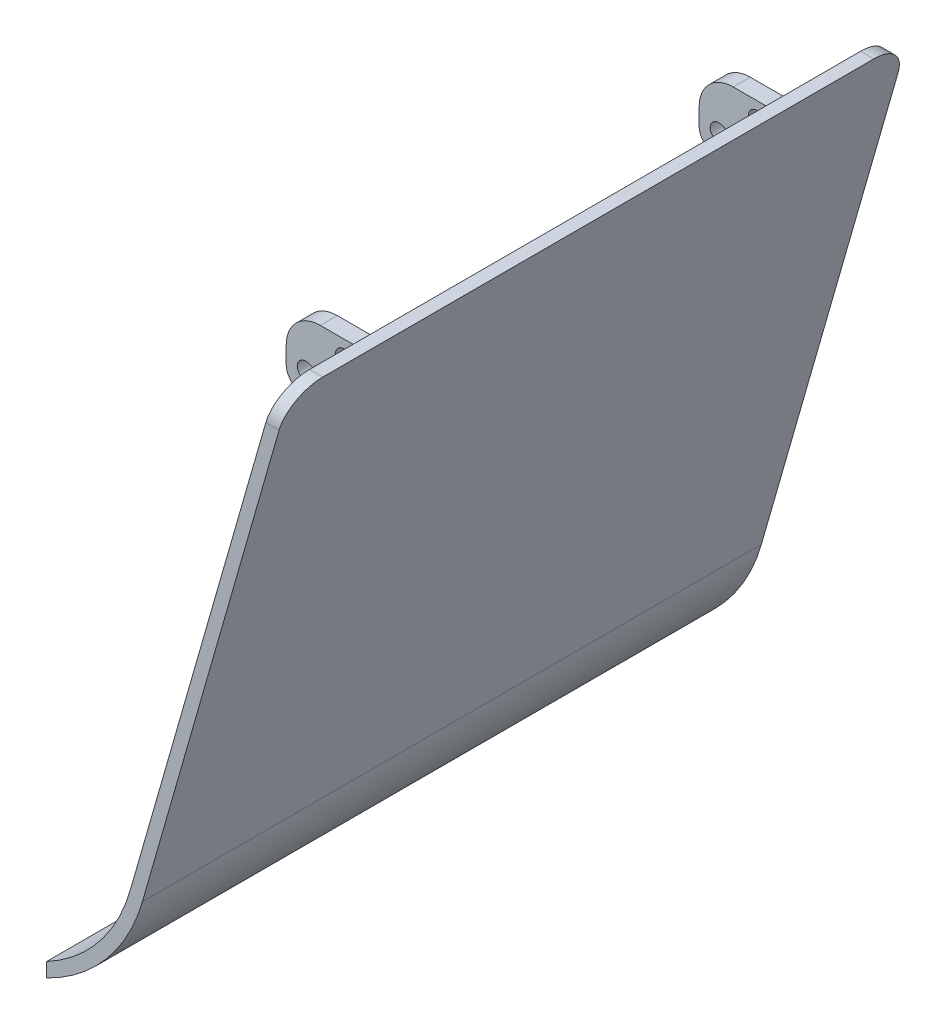
ISO-10303-21;
HEADER;
FILE_DESCRIPTION(('STEP AP214'),'2;1');
FILE_NAME('part.step','',(''),(''),'','','');
FILE_SCHEMA(('AUTOMOTIVE_DESIGN { 1 0 10303 214 1 1 1 1 }'));
ENDSEC;
DATA;
#1=APPLICATION_CONTEXT('core data for automotive mechanical design processes');
#2=APPLICATION_PROTOCOL_DEFINITION('international standard','automotive_design',2000,#1);
#3=PRODUCT_CONTEXT('',#1,'mechanical');
#4=PRODUCT('Part','Part','',(#3));
#5=PRODUCT_RELATED_PRODUCT_CATEGORY('part','',(#4));
#6=PRODUCT_DEFINITION_FORMATION('','',#4);
#7=PRODUCT_DEFINITION_CONTEXT('part definition',#1,'design');
#8=PRODUCT_DEFINITION('design','',#6,#7);
#9=PRODUCT_DEFINITION_SHAPE('','',#8);
#10=(LENGTH_UNIT() NAMED_UNIT(*) SI_UNIT(.MILLI.,.METRE.));
#11=(NAMED_UNIT(*) PLANE_ANGLE_UNIT() SI_UNIT($,.RADIAN.));
#12=(NAMED_UNIT(*) SI_UNIT($,.STERADIAN.) SOLID_ANGLE_UNIT());
#13=UNCERTAINTY_MEASURE_WITH_UNIT(LENGTH_MEASURE(1.E-05),#10,'distance_accuracy_value','');
#14=(GEOMETRIC_REPRESENTATION_CONTEXT(3) GLOBAL_UNCERTAINTY_ASSIGNED_CONTEXT((#13)) GLOBAL_UNIT_ASSIGNED_CONTEXT((#10,
#11,#12)) REPRESENTATION_CONTEXT('',''));
#15=CARTESIAN_POINT('',(0.,0.,0.));
#16=DIRECTION('',(0.,0.,1.));
#17=DIRECTION('',(1.,0.,0.));
#18=AXIS2_PLACEMENT_3D('',#15,#16,#17);
#19=CARTESIAN_POINT('',(-0.573490771517624,-2.,-23.3));
#20=DIRECTION('',(0.,0.,-1.));
#21=DIRECTION('',(1.,0.,0.));
#22=AXIS2_PLACEMENT_3D('',#19,#20,#21);
#23=PLANE('',#22);
#24=DIRECTION('',(0.,-1.,0.));
#25=VECTOR('',#24,1.);
#26=CARTESIAN_POINT('',(-9.86745385758813,-2.,-23.3));
#27=LINE('',#26,#25);
#28=CARTESIAN_POINT('',(-9.86745385758812,-6.,-23.3));
#29=VERTEX_POINT('',#28);
#30=CARTESIAN_POINT('',(-9.86745385758812,-8.,-23.3));
#31=VERTEX_POINT('',#30);
#32=EDGE_CURVE('E264',#29,#31,#27,.T.);
#33=ORIENTED_EDGE('',*,*,#32,.T.);
#34=CARTESIAN_POINT('',(-7.86745385758812,-8.,-23.3));
#35=DIRECTION('',(0.,0.,-1.));
#36=DIRECTION('',(-1.,0.,0.));
#37=AXIS2_PLACEMENT_3D('',#34,#35,#36);
#38=CIRCLE('',#37,2.);
#39=CARTESIAN_POINT('',(-7.86745385758812,-10.,-23.3));
#40=VERTEX_POINT('',#39);
#41=EDGE_CURVE('E11',#31,#40,#38,.F.);
#42=ORIENTED_EDGE('',*,*,#41,.T.);
#43=DIRECTION('',(1.,0.,0.));
#44=VECTOR('',#43,1.);
#45=CARTESIAN_POINT('',(-9.86745385758812,-10.,-23.3));
#46=LINE('',#45,#44);
#47=CARTESIAN_POINT('',(-2.86745385758812,-10.,-23.3));
#48=VERTEX_POINT('',#47);
#49=EDGE_CURVE('E261',#40,#48,#46,.T.);
#50=ORIENTED_EDGE('',*,*,#49,.T.);
#51=DIRECTION('',(0.275637355817003,0.961261695938318,0.));
#52=VECTOR('',#51,1.);
#53=CARTESIAN_POINT('',(-2.86745385758812,-10.,-23.3));
#54=LINE('',#53,#52);
#55=CARTESIAN_POINT('',(-0.573490771517624,-2.,-23.3));
#56=VERTEX_POINT('',#55);
#57=EDGE_CURVE('E258',#48,#56,#54,.T.);
#58=ORIENTED_EDGE('',*,*,#57,.T.);
#59=DIRECTION('',(-1.,0.,0.));
#60=VECTOR('',#59,1.);
#61=CARTESIAN_POINT('',(-0.573490771517624,-2.,-23.3));
#62=LINE('',#61,#60);
#63=CARTESIAN_POINT('',(-5.86745385758812,-2.,-23.3));
#64=VERTEX_POINT('',#63);
#65=EDGE_CURVE('E266',#56,#64,#62,.T.);
#66=ORIENTED_EDGE('',*,*,#65,.T.);
#67=CARTESIAN_POINT('',(-5.86745385758812,-6.,-23.3));
#68=DIRECTION('',(0.,0.,-1.));
#69=DIRECTION('',(-1.,0.,0.));
#70=AXIS2_PLACEMENT_3D('',#67,#68,#69);
#71=CIRCLE('',#70,4.);
#72=EDGE_CURVE('E427',#64,#29,#71,.F.);
#73=ORIENTED_EDGE('',*,*,#72,.T.);
#74=EDGE_LOOP('',(#33,#42,#50,#58,#66,#73));
#75=FACE_BOUND('',#74,.T.);
#76=CARTESIAN_POINT('',(-6.21585626373581,-4.60204194662536,-23.3));
#77=DIRECTION('',(0.,0.,-1.));
#78=DIRECTION('',(-1.,0.,0.));
#79=AXIS2_PLACEMENT_3D('',#76,#77,#78);
#80=CIRCLE('',#79,2.2);
#81=CARTESIAN_POINT('',(-4.05514258241743,-4.18813810832042,-23.3));
#82=VERTEX_POINT('',#81);
#83=CARTESIAN_POINT('',(-7.14889258241743,-6.59438810832043,-23.3));
#84=VERTEX_POINT('',#83);
#85=EDGE_CURVE('E255',#82,#84,#80,.T.);
#86=ORIENTED_EDGE('',*,*,#85,.F.);
#87=CARTESIAN_POINT('',(-3.07299999999998,-4.,-23.3));
#88=DIRECTION('',(0.,0.,-1.));
#89=DIRECTION('',(-1.,0.,0.));
#90=AXIS2_PLACEMENT_3D('',#87,#88,#89);
#91=CIRCLE('',#90,1.);
#92=CARTESIAN_POINT('',(-2.09085741758253,-3.81186189167957,-23.3));
#93=VERTEX_POINT('',#92);
#94=EDGE_CURVE('E248',#93,#82,#91,.F.);
#95=ORIENTED_EDGE('',*,*,#94,.F.);
#96=CARTESIAN_POINT('',(-6.21585626373581,-4.60204194662536,-23.3));
#97=DIRECTION('',(0.,0.,-1.));
#98=DIRECTION('',(-1.,0.,0.));
#99=AXIS2_PLACEMENT_3D('',#96,#97,#98);
#100=CIRCLE('',#99,4.2);
#101=CARTESIAN_POINT('',(-7.99710741758254,-8.40561189167958,-23.3));
#102=VERTEX_POINT('',#101);
#103=EDGE_CURVE('E224',#102,#93,#100,.F.);
#104=ORIENTED_EDGE('',*,*,#103,.F.);
#105=CARTESIAN_POINT('',(-7.57299999999998,-7.5,-23.3));
#106=DIRECTION('',(0.,0.,-1.));
#107=DIRECTION('',(-1.,0.,0.));
#108=AXIS2_PLACEMENT_3D('',#105,#106,#107);
#109=CIRCLE('',#108,1.);
#110=EDGE_CURVE('E253',#84,#102,#109,.F.);
#111=ORIENTED_EDGE('',*,*,#110,.F.);
#112=EDGE_LOOP('',(#86,#95,#104,#111));
#113=FACE_BOUND('',#112,.T.);
#114=ADVANCED_FACE('F31',(#75,#113),#23,.F.);
#115=CARTESIAN_POINT('',(-0.573490771517624,-2.,-25.3));
#116=DIRECTION('',(0.,0.,-1.));
#117=DIRECTION('',(1.,0.,0.));
#118=AXIS2_PLACEMENT_3D('',#115,#116,#117);
#119=PLANE('',#118);
#120=DIRECTION('',(1.,0.,0.));
#121=VECTOR('',#120,1.);
#122=CARTESIAN_POINT('',(-9.86745385758812,-10.,-25.3));
#123=LINE('',#122,#121);
#124=CARTESIAN_POINT('',(-7.86745385758812,-10.,-25.3));
#125=VERTEX_POINT('',#124);
#126=CARTESIAN_POINT('',(-2.86745385758812,-10.,-25.3));
#127=VERTEX_POINT('',#126);
#128=EDGE_CURVE('E272',#125,#127,#123,.T.);
#129=ORIENTED_EDGE('',*,*,#128,.F.);
#130=CARTESIAN_POINT('',(-7.86745385758812,-8.,-25.3));
#131=DIRECTION('',(0.,0.,-1.));
#132=DIRECTION('',(-1.,0.,0.));
#133=AXIS2_PLACEMENT_3D('',#130,#131,#132);
#134=CIRCLE('',#133,2.);
#135=CARTESIAN_POINT('',(-9.86745385758812,-8.,-25.3));
#136=VERTEX_POINT('',#135);
#137=EDGE_CURVE('E53',#125,#136,#134,.T.);
#138=ORIENTED_EDGE('',*,*,#137,.T.);
#139=DIRECTION('',(0.,-1.,0.));
#140=VECTOR('',#139,1.);
#141=CARTESIAN_POINT('',(-9.86745385758813,-2.,-25.3));
#142=LINE('',#141,#140);
#143=CARTESIAN_POINT('',(-9.86745385758812,-6.,-25.3));
#144=VERTEX_POINT('',#143);
#145=EDGE_CURVE('E274',#144,#136,#142,.T.);
#146=ORIENTED_EDGE('',*,*,#145,.F.);
#147=CARTESIAN_POINT('',(-5.86745385758812,-6.,-25.3));
#148=DIRECTION('',(0.,0.,-1.));
#149=DIRECTION('',(-1.,0.,0.));
#150=AXIS2_PLACEMENT_3D('',#147,#148,#149);
#151=CIRCLE('',#150,4.);
#152=CARTESIAN_POINT('',(-5.86745385758812,-2.,-25.3));
#153=VERTEX_POINT('',#152);
#154=EDGE_CURVE('E423',#144,#153,#151,.T.);
#155=ORIENTED_EDGE('',*,*,#154,.T.);
#156=DIRECTION('',(-1.,0.,0.));
#157=VECTOR('',#156,1.);
#158=CARTESIAN_POINT('',(-0.573490771517624,-2.,-25.3));
#159=LINE('',#158,#157);
#160=CARTESIAN_POINT('',(-0.573490771517624,-2.,-25.3));
#161=VERTEX_POINT('',#160);
#162=EDGE_CURVE('E262',#161,#153,#159,.T.);
#163=ORIENTED_EDGE('',*,*,#162,.F.);
#164=DIRECTION('',(0.275637355817003,0.961261695938318,0.));
#165=VECTOR('',#164,1.);
#166=CARTESIAN_POINT('',(-2.86745385758812,-10.,-25.3));
#167=LINE('',#166,#165);
#168=EDGE_CURVE('E257',#127,#161,#167,.T.);
#169=ORIENTED_EDGE('',*,*,#168,.F.);
#170=EDGE_LOOP('',(#129,#138,#146,#155,#163,#169));
#171=FACE_BOUND('',#170,.T.);
#172=CARTESIAN_POINT('',(-3.07299999999998,-4.,-25.3));
#173=DIRECTION('',(0.,0.,1.));
#174=DIRECTION('',(1.,0.,0.));
#175=AXIS2_PLACEMENT_3D('',#172,#173,#174);
#176=CIRCLE('',#175,1.);
#177=CARTESIAN_POINT('',(-2.09085741758253,-3.81186189167957,-25.3));
#178=VERTEX_POINT('',#177);
#179=CARTESIAN_POINT('',(-4.05514258241743,-4.18813810832042,-25.3));
#180=VERTEX_POINT('',#179);
#181=EDGE_CURVE('E232',#178,#180,#176,.T.);
#182=ORIENTED_EDGE('',*,*,#181,.T.);
#183=CARTESIAN_POINT('',(-6.21585626373581,-4.60204194662536,-25.3));
#184=DIRECTION('',(0.,0.,-1.));
#185=DIRECTION('',(1.,0.,0.));
#186=AXIS2_PLACEMENT_3D('',#183,#184,#185);
#187=CIRCLE('',#186,2.2);
#188=CARTESIAN_POINT('',(-7.14889258241743,-6.59438810832043,-25.3));
#189=VERTEX_POINT('',#188);
#190=EDGE_CURVE('E237',#180,#189,#187,.T.);
#191=ORIENTED_EDGE('',*,*,#190,.T.);
#192=CARTESIAN_POINT('',(-7.57299999999998,-7.5,-25.3));
#193=DIRECTION('',(0.,0.,1.));
#194=DIRECTION('',(1.,0.,0.));
#195=AXIS2_PLACEMENT_3D('',#192,#193,#194);
#196=CIRCLE('',#195,1.);
#197=CARTESIAN_POINT('',(-7.99710741758254,-8.40561189167958,-25.3));
#198=VERTEX_POINT('',#197);
#199=EDGE_CURVE('E241',#189,#198,#196,.T.);
#200=ORIENTED_EDGE('',*,*,#199,.T.);
#201=CARTESIAN_POINT('',(-6.21585626373581,-4.60204194662536,-25.3));
#202=DIRECTION('',(0.,0.,1.));
#203=DIRECTION('',(1.,0.,0.));
#204=AXIS2_PLACEMENT_3D('',#201,#202,#203);
#205=CIRCLE('',#204,4.2);
#206=EDGE_CURVE('E221',#198,#178,#205,.T.);
#207=ORIENTED_EDGE('',*,*,#206,.T.);
#208=EDGE_LOOP('',(#182,#191,#200,#207));
#209=FACE_BOUND('',#208,.T.);
#210=ADVANCED_FACE('F239',(#171,#209),#119,.T.);
#211=CARTESIAN_POINT('',(0.,0.,36.425));
#212=DIRECTION('',(0.961261695938318,-0.275637355817003,0.));
#213=DIRECTION('',(0.275637355817003,0.961261695938318,0.));
#214=AXIS2_PLACEMENT_3D('',#211,#212,#213);
#215=PLANE('',#214);
#216=DIRECTION('',(0.275637355817003,0.961261695938318,0.));
#217=VECTOR('',#216,1.);
#218=CARTESIAN_POINT('',(-2.86745385758812,-10.,23.3));
#219=LINE('',#218,#217);
#220=CARTESIAN_POINT('',(-2.86745385758812,-10.,23.3));
#221=VERTEX_POINT('',#220);
#222=CARTESIAN_POINT('',(-0.573490771517624,-2.,23.3));
#223=VERTEX_POINT('',#222);
#224=EDGE_CURVE('E315',#221,#223,#219,.T.);
#225=ORIENTED_EDGE('',*,*,#224,.T.);
#226=DIRECTION('',(0.,0.,1.));
#227=VECTOR('',#226,1.);
#228=CARTESIAN_POINT('',(-0.573490771517624,-2.,23.3));
#229=LINE('',#228,#227);
#230=CARTESIAN_POINT('',(-0.573490771517624,-2.,25.3));
#231=VERTEX_POINT('',#230);
#232=EDGE_CURVE('E327',#223,#231,#229,.T.);
#233=ORIENTED_EDGE('',*,*,#232,.T.);
#234=DIRECTION('',(0.275637355817003,0.961261695938318,0.));
#235=VECTOR('',#234,1.);
#236=CARTESIAN_POINT('',(-2.86745385758812,-10.,25.3));
#237=LINE('',#236,#235);
#238=CARTESIAN_POINT('',(-2.86745385758812,-10.,25.3));
#239=VERTEX_POINT('',#238);
#240=EDGE_CURVE('E314',#239,#231,#237,.T.);
#241=ORIENTED_EDGE('',*,*,#240,.F.);
#242=DIRECTION('',(0.,0.,1.));
#243=VECTOR('',#242,1.);
#244=CARTESIAN_POINT('',(-2.86745385758812,-10.,23.3));
#245=LINE('',#244,#243);
#246=EDGE_CURVE('E337',#221,#239,#245,.T.);
#247=ORIENTED_EDGE('',*,*,#246,.F.);
#248=EDGE_LOOP('',(#225,#233,#241,#247));
#249=FACE_BOUND('',#248,.T.);
#250=DIRECTION('',(0.,0.,-1.));
#251=VECTOR('',#250,1.);
#252=CARTESIAN_POINT('',(0.,0.,36.425));
#253=LINE('',#252,#251);
#254=CARTESIAN_POINT('',(0.,0.,32.425));
#255=VERTEX_POINT('',#254);
#256=CARTESIAN_POINT('',(0.,0.,-32.425));
#257=VERTEX_POINT('',#256);
#258=EDGE_CURVE('E381',#255,#257,#253,.T.);
#259=ORIENTED_EDGE('',*,*,#258,.T.);
#260=CARTESIAN_POINT('',(-1.14698154303525,-4.,-32.425));
#261=DIRECTION('',(0.961261695938318,-0.275637355817003,0.));
#262=DIRECTION('',(-0.275637355817003,-0.961261695938318,0.));
#263=AXIS2_PLACEMENT_3D('',#260,#261,#262);
#264=ELLIPSE('',#263,4.16119774344641,4.);
#265=CARTESIAN_POINT('',(-1.14698154303525,-4.,-36.425));
#266=VERTEX_POINT('',#265);
#267=EDGE_CURVE('E391',#257,#266,#264,.F.);
#268=ORIENTED_EDGE('',*,*,#267,.T.);
#269=DIRECTION('',(-0.275637355817003,-0.961261695938318,0.));
#270=VECTOR('',#269,1.);
#271=CARTESIAN_POINT('',(0.,0.,-36.425));
#272=LINE('',#271,#270);
#273=CARTESIAN_POINT('',(-17.110884891163,-59.67274711634,-36.425));
#274=VERTEX_POINT('',#273);
#275=EDGE_CURVE('E352',#266,#274,#272,.T.);
#276=ORIENTED_EDGE('',*,*,#275,.T.);
#277=DIRECTION('',(0.,0.,-1.));
#278=VECTOR('',#277,1.);
#279=CARTESIAN_POINT('',(-17.110884891163,-59.67274711634,36.425));
#280=LINE('',#279,#278);
#281=CARTESIAN_POINT('',(-17.110884891163,-59.67274711634,36.425));
#282=VERTEX_POINT('',#281);
#283=EDGE_CURVE('E378',#282,#274,#280,.T.);
#284=ORIENTED_EDGE('',*,*,#283,.F.);
#285=DIRECTION('',(-0.275637355817003,-0.961261695938318,0.));
#286=VECTOR('',#285,1.);
#287=CARTESIAN_POINT('',(0.,0.,36.425));
#288=LINE('',#287,#286);
#289=CARTESIAN_POINT('',(-1.14698154303525,-4.,36.425));
#290=VERTEX_POINT('',#289);
#291=EDGE_CURVE('E353',#290,#282,#288,.T.);
#292=ORIENTED_EDGE('',*,*,#291,.F.);
#293=CARTESIAN_POINT('',(-1.14698154303525,-4.,32.425));
#294=DIRECTION('',(0.961261695938318,-0.275637355817003,0.));
#295=DIRECTION('',(0.275637355817003,0.961261695938318,0.));
#296=AXIS2_PLACEMENT_3D('',#293,#294,#295);
#297=ELLIPSE('',#296,4.16119774344641,4.);
#298=EDGE_CURVE('E389',#290,#255,#297,.F.);
#299=ORIENTED_EDGE('',*,*,#298,.T.);
#300=EDGE_LOOP('',(#259,#268,#276,#284,#292,#299));
#301=FACE_BOUND('',#300,.T.);
#302=ORIENTED_EDGE('',*,*,#57,.F.);
#303=DIRECTION('',(0.,0.,-1.));
#304=VECTOR('',#303,1.);
#305=CARTESIAN_POINT('',(-2.86745385758812,-10.,-23.3));
#306=LINE('',#305,#304);
#307=EDGE_CURVE('E269',#48,#127,#306,.T.);
#308=ORIENTED_EDGE('',*,*,#307,.T.);
#309=ORIENTED_EDGE('',*,*,#168,.T.);
#310=DIRECTION('',(0.,0.,-1.));
#311=VECTOR('',#310,1.);
#312=CARTESIAN_POINT('',(-0.573490771517624,-2.,-23.3));
#313=LINE('',#312,#311);
#314=EDGE_CURVE('E278',#56,#161,#313,.T.);
#315=ORIENTED_EDGE('',*,*,#314,.F.);
#316=EDGE_LOOP('',(#302,#308,#309,#315));
#317=FACE_BOUND('',#316,.T.);
#318=ADVANCED_FACE('F444',(#249,#301,#317),#215,.F.);
#319=CARTESIAN_POINT('',(0.,0.,36.425));
#320=DIRECTION('',(0.,-1.,0.));
#321=DIRECTION('',(0.,0.,-1.));
#322=AXIS2_PLACEMENT_3D('',#319,#320,#321);
#323=PLANE('',#322);
#324=DIRECTION('',(0.,0.,-1.));
#325=VECTOR('',#324,1.);
#326=CARTESIAN_POINT('',(1.5604491537924,0.,36.425));
#327=LINE('',#326,#325);
#328=CARTESIAN_POINT('',(1.5604491537924,0.,32.425));
#329=VERTEX_POINT('',#328);
#330=CARTESIAN_POINT('',(1.5604491537924,0.,-32.425));
#331=VERTEX_POINT('',#330);
#332=EDGE_CURVE('E364',#329,#331,#327,.T.);
#333=ORIENTED_EDGE('',*,*,#332,.T.);
#334=DIRECTION('',(-1.,0.,0.));
#335=VECTOR('',#334,1.);
#336=CARTESIAN_POINT('',(0.,0.,-32.425));
#337=LINE('',#336,#335);
#338=EDGE_CURVE('E386',#331,#257,#337,.T.);
#339=ORIENTED_EDGE('',*,*,#338,.T.);
#340=ORIENTED_EDGE('',*,*,#258,.F.);
#341=DIRECTION('',(-1.,0.,0.));
#342=VECTOR('',#341,1.);
#343=CARTESIAN_POINT('',(1.56044915379241,0.,32.425));
#344=LINE('',#343,#342);
#345=EDGE_CURVE('E384',#255,#329,#344,.F.);
#346=ORIENTED_EDGE('',*,*,#345,.T.);
#347=EDGE_LOOP('',(#333,#339,#340,#346));
#348=FACE_BOUND('',#347,.T.);
#349=ADVANCED_FACE('F536',(#348),#323,.F.);
#350=CARTESIAN_POINT('',(-36.3361188099293,-54.16,36.425));
#351=DIRECTION('',(0.,0.,-1.));
#352=DIRECTION('',(-1.,0.,0.));
#353=AXIS2_PLACEMENT_3D('',#350,#351,#352);
#354=CYLINDRICAL_SURFACE('',#353,20.);
#355=CARTESIAN_POINT('',(-36.3361188099293,-54.16,-36.425));
#356=DIRECTION('',(0.,0.,-1.));
#357=DIRECTION('',(1.,0.,0.));
#358=AXIS2_PLACEMENT_3D('',#355,#356,#357);
#359=CIRCLE('',#358,20.);
#360=CARTESIAN_POINT('',(-26.9438666838416,-71.8174516847704,-36.425));
#361=VERTEX_POINT('',#360);
#362=EDGE_CURVE('E366',#274,#361,#359,.T.);
#363=ORIENTED_EDGE('',*,*,#362,.T.);
#364=DIRECTION('',(0.,0.,1.));
#365=VECTOR('',#364,1.);
#366=CARTESIAN_POINT('',(-26.9438666838416,-71.8174516847704,-36.425));
#367=LINE('',#366,#365);
#368=CARTESIAN_POINT('',(-26.9438666838416,-71.8174516847704,36.425));
#369=VERTEX_POINT('',#368);
#370=EDGE_CURVE('E346',#361,#369,#367,.T.);
#371=ORIENTED_EDGE('',*,*,#370,.T.);
#372=CARTESIAN_POINT('',(-36.3361188099293,-54.16,36.425));
#373=DIRECTION('',(0.,0.,-1.));
#374=DIRECTION('',(1.,0.,0.));
#375=AXIS2_PLACEMENT_3D('',#372,#373,#374);
#376=CIRCLE('',#375,20.);
#377=EDGE_CURVE('E355',#282,#369,#376,.T.);
#378=ORIENTED_EDGE('',*,*,#377,.F.);
#379=ORIENTED_EDGE('',*,*,#283,.T.);
#380=EDGE_LOOP('',(#363,#371,#378,#379));
#381=FACE_BOUND('',#380,.T.);
#382=ADVANCED_FACE('F532',(#381),#354,.F.);
#383=CARTESIAN_POINT('',(-36.3361188099293,-54.16,36.425));
#384=DIRECTION('',(0.,0.,-1.));
#385=DIRECTION('',(-1.,0.,0.));
#386=AXIS2_PLACEMENT_3D('',#383,#384,#385);
#387=CYLINDRICAL_SURFACE('',#386,21.5);
#388=CARTESIAN_POINT('',(-36.3361188099293,-54.16,36.425));
#389=DIRECTION('',(0.,0.,1.));
#390=DIRECTION('',(1.,0.,0.));
#391=AXIS2_PLACEMENT_3D('',#388,#389,#390);
#392=CIRCLE('',#391,21.5);
#393=CARTESIAN_POINT('',(-26.9438666838416,-73.5,36.425));
#394=VERTEX_POINT('',#393);
#395=CARTESIAN_POINT('',(-15.6689923472555,-60.0862031500656,36.425));
#396=VERTEX_POINT('',#395);
#397=EDGE_CURVE('E359',#394,#396,#392,.T.);
#398=ORIENTED_EDGE('',*,*,#397,.F.);
#399=DIRECTION('',(0.,0.,1.));
#400=VECTOR('',#399,1.);
#401=CARTESIAN_POINT('',(-26.9438666838416,-73.5,-36.425));
#402=LINE('',#401,#400);
#403=CARTESIAN_POINT('',(-26.9438666838416,-73.5,-36.425));
#404=VERTEX_POINT('',#403);
#405=EDGE_CURVE('E350',#404,#394,#402,.T.);
#406=ORIENTED_EDGE('',*,*,#405,.F.);
#407=CARTESIAN_POINT('',(-36.3361188099293,-54.16,-36.425));
#408=DIRECTION('',(0.,0.,1.));
#409=DIRECTION('',(1.,0.,0.));
#410=AXIS2_PLACEMENT_3D('',#407,#408,#409);
#411=CIRCLE('',#410,21.5);
#412=CARTESIAN_POINT('',(-15.6689923472555,-60.0862031500656,-36.425));
#413=VERTEX_POINT('',#412);
#414=EDGE_CURVE('E369',#404,#413,#411,.T.);
#415=ORIENTED_EDGE('',*,*,#414,.T.);
#416=DIRECTION('',(0.,0.,-1.));
#417=VECTOR('',#416,1.);
#418=CARTESIAN_POINT('',(-15.6689923472555,-60.0862031500656,36.425));
#419=LINE('',#418,#417);
#420=EDGE_CURVE('E375',#396,#413,#419,.T.);
#421=ORIENTED_EDGE('',*,*,#420,.F.);
#422=EDGE_LOOP('',(#398,#406,#415,#421));
#423=FACE_BOUND('',#422,.T.);
#424=ADVANCED_FACE('F528',(#423),#387,.T.);
#425=CARTESIAN_POINT('',(1.5604491537924,0.,36.425));
#426=DIRECTION('',(-0.961261695938318,0.275637355817002,0.));
#427=DIRECTION('',(-0.275637355817002,-0.961261695938318,0.));
#428=AXIS2_PLACEMENT_3D('',#425,#426,#427);
#429=PLANE('',#428);
#430=DIRECTION('',(0.275637355817002,0.961261695938318,0.));
#431=VECTOR('',#430,1.);
#432=CARTESIAN_POINT('',(1.5604491537924,0.,-36.425));
#433=LINE('',#432,#431);
#434=CARTESIAN_POINT('',(0.413467610757159,-4.,-36.425));
#435=VERTEX_POINT('',#434);
#436=EDGE_CURVE('E356',#413,#435,#433,.T.);
#437=ORIENTED_EDGE('',*,*,#436,.T.);
#438=CARTESIAN_POINT('',(0.413467610757159,-4.,-32.425));
#439=DIRECTION('',(-0.961261695938318,0.275637355817002,0.));
#440=DIRECTION('',(-0.275637355817002,-0.961261695938318,0.));
#441=AXIS2_PLACEMENT_3D('',#438,#439,#440);
#442=ELLIPSE('',#441,4.16119774344641,4.);
#443=EDGE_CURVE('E397',#435,#331,#442,.F.);
#444=ORIENTED_EDGE('',*,*,#443,.T.);
#445=ORIENTED_EDGE('',*,*,#332,.F.);
#446=CARTESIAN_POINT('',(0.413467610757161,-4.,32.425));
#447=DIRECTION('',(-0.961261695938318,0.275637355817002,0.));
#448=DIRECTION('',(0.275637355817002,0.961261695938318,0.));
#449=AXIS2_PLACEMENT_3D('',#446,#447,#448);
#450=ELLIPSE('',#449,4.16119774344641,4.);
#451=CARTESIAN_POINT('',(0.413467610757157,-4.,36.425));
#452=VERTEX_POINT('',#451);
#453=EDGE_CURVE('E395',#329,#452,#450,.F.);
#454=ORIENTED_EDGE('',*,*,#453,.T.);
#455=DIRECTION('',(0.275637355817003,0.961261695938318,0.));
#456=VECTOR('',#455,1.);
#457=CARTESIAN_POINT('',(1.44189254390748,-0.413456033725504,36.425));
#458=LINE('',#457,#456);
#459=EDGE_CURVE('E361',#396,#452,#458,.T.);
#460=ORIENTED_EDGE('',*,*,#459,.F.);
#461=ORIENTED_EDGE('',*,*,#420,.T.);
#462=EDGE_LOOP('',(#437,#444,#445,#454,#460,#461));
#463=FACE_BOUND('',#462,.T.);
#464=ADVANCED_FACE('F521',(#463),#429,.F.);
#465=CARTESIAN_POINT('',(-36.3361188099293,-54.16,36.425));
#466=DIRECTION('',(0.,0.,1.));
#467=DIRECTION('',(1.,0.,0.));
#468=AXIS2_PLACEMENT_3D('',#465,#466,#467);
#469=PLANE('',#468);
#470=ORIENTED_EDGE('',*,*,#459,.T.);
#471=DIRECTION('',(-1.,0.,0.));
#472=VECTOR('',#471,1.);
#473=CARTESIAN_POINT('',(0.,-4.,36.425));
#474=LINE('',#473,#472);
#475=EDGE_CURVE('E399',#452,#290,#474,.T.);
#476=ORIENTED_EDGE('',*,*,#475,.T.);
#477=ORIENTED_EDGE('',*,*,#291,.T.);
#478=ORIENTED_EDGE('',*,*,#377,.T.);
#479=DIRECTION('',(0.,1.,0.));
#480=VECTOR('',#479,1.);
#481=CARTESIAN_POINT('',(-26.9438666838416,-73.5,36.425));
#482=LINE('',#481,#480);
#483=EDGE_CURVE('E340',#394,#369,#482,.T.);
#484=ORIENTED_EDGE('',*,*,#483,.F.);
#485=ORIENTED_EDGE('',*,*,#397,.T.);
#486=EDGE_LOOP('',(#470,#476,#477,#478,#484,#485));
#487=FACE_BOUND('',#486,.T.);
#488=ADVANCED_FACE('F518',(#487),#469,.T.);
#489=CARTESIAN_POINT('',(-36.3361188099293,-54.16,-36.425));
#490=DIRECTION('',(0.,0.,1.));
#491=DIRECTION('',(1.,0.,0.));
#492=AXIS2_PLACEMENT_3D('',#489,#490,#491);
#493=PLANE('',#492);
#494=ORIENTED_EDGE('',*,*,#275,.F.);
#495=DIRECTION('',(-1.,0.,0.));
#496=VECTOR('',#495,1.);
#497=CARTESIAN_POINT('',(-36.3361188099293,-4.,-36.425));
#498=LINE('',#497,#496);
#499=EDGE_CURVE('E393',#266,#435,#498,.F.);
#500=ORIENTED_EDGE('',*,*,#499,.T.);
#501=ORIENTED_EDGE('',*,*,#436,.F.);
#502=ORIENTED_EDGE('',*,*,#414,.F.);
#503=DIRECTION('',(0.,1.,0.));
#504=VECTOR('',#503,1.);
#505=CARTESIAN_POINT('',(-26.9438666838416,-73.5,-36.425));
#506=LINE('',#505,#504);
#507=EDGE_CURVE('E343',#404,#361,#506,.T.);
#508=ORIENTED_EDGE('',*,*,#507,.T.);
#509=ORIENTED_EDGE('',*,*,#362,.F.);
#510=EDGE_LOOP('',(#494,#500,#501,#502,#508,#509));
#511=FACE_BOUND('',#510,.T.);
#512=ADVANCED_FACE('F516',(#511),#493,.F.);
#513=CARTESIAN_POINT('',(-26.9438666838416,-73.5,-36.425));
#514=DIRECTION('',(1.,0.,0.));
#515=DIRECTION('',(0.,0.,-1.));
#516=AXIS2_PLACEMENT_3D('',#513,#514,#515);
#517=PLANE('',#516);
#518=ORIENTED_EDGE('',*,*,#483,.T.);
#519=ORIENTED_EDGE('',*,*,#370,.F.);
#520=ORIENTED_EDGE('',*,*,#507,.F.);
#521=ORIENTED_EDGE('',*,*,#405,.T.);
#522=EDGE_LOOP('',(#518,#519,#520,#521));
#523=FACE_BOUND('',#522,.T.);
#524=ADVANCED_FACE('F512',(#523),#517,.F.);
#525=CARTESIAN_POINT('',(0.,-4.,-32.425));
#526=DIRECTION('',(-1.,0.,0.));
#527=DIRECTION('',(0.,0.,1.));
#528=AXIS2_PLACEMENT_3D('',#525,#526,#527);
#529=CYLINDRICAL_SURFACE('',#528,4.);
#530=ORIENTED_EDGE('',*,*,#443,.F.);
#531=ORIENTED_EDGE('',*,*,#499,.F.);
#532=ORIENTED_EDGE('',*,*,#267,.F.);
#533=ORIENTED_EDGE('',*,*,#338,.F.);
#534=EDGE_LOOP('',(#530,#531,#532,#533));
#535=FACE_BOUND('',#534,.T.);
#536=ADVANCED_FACE('F515',(#535),#529,.T.);
#537=CARTESIAN_POINT('',(-36.3361188099293,-4.,32.425));
#538=DIRECTION('',(1.,0.,0.));
#539=DIRECTION('',(0.,0.,-1.));
#540=AXIS2_PLACEMENT_3D('',#537,#538,#539);
#541=CYLINDRICAL_SURFACE('',#540,4.);
#542=ORIENTED_EDGE('',*,*,#453,.F.);
#543=ORIENTED_EDGE('',*,*,#345,.F.);
#544=ORIENTED_EDGE('',*,*,#298,.F.);
#545=ORIENTED_EDGE('',*,*,#475,.F.);
#546=EDGE_LOOP('',(#542,#543,#544,#545));
#547=FACE_BOUND('',#546,.T.);
#548=ADVANCED_FACE('F504',(#547),#541,.T.);
#549=CARTESIAN_POINT('',(-9.86745385758812,-10.,23.3));
#550=DIRECTION('',(0.,-1.,0.));
#551=DIRECTION('',(1.,0.,0.));
#552=AXIS2_PLACEMENT_3D('',#549,#550,#551);
#553=PLANE('',#552);
#554=DIRECTION('',(1.,0.,0.));
#555=VECTOR('',#554,1.);
#556=CARTESIAN_POINT('',(-9.86745385758812,-10.,25.3));
#557=LINE('',#556,#555);
#558=CARTESIAN_POINT('',(-7.86745385758812,-10.,25.3));
#559=VERTEX_POINT('',#558);
#560=EDGE_CURVE('E319',#559,#239,#557,.T.);
#561=ORIENTED_EDGE('',*,*,#560,.F.);
#562=DIRECTION('',(0.,0.,1.));
#563=VECTOR('',#562,1.);
#564=CARTESIAN_POINT('',(-7.86745385758812,-10.,23.3));
#565=LINE('',#564,#563);
#566=CARTESIAN_POINT('',(-7.86745385758812,-10.,23.3));
#567=VERTEX_POINT('',#566);
#568=EDGE_CURVE('E416',#559,#567,#565,.F.);
#569=ORIENTED_EDGE('',*,*,#568,.T.);
#570=DIRECTION('',(1.,0.,0.));
#571=VECTOR('',#570,1.);
#572=CARTESIAN_POINT('',(-9.86745385758812,-10.,23.3));
#573=LINE('',#572,#571);
#574=EDGE_CURVE('E325',#567,#221,#573,.T.);
#575=ORIENTED_EDGE('',*,*,#574,.T.);
#576=ORIENTED_EDGE('',*,*,#246,.T.);
#577=EDGE_LOOP('',(#561,#569,#575,#576));
#578=FACE_BOUND('',#577,.T.);
#579=ADVANCED_FACE('F500',(#578),#553,.T.);
#580=CARTESIAN_POINT('',(-9.86745385758813,-2.,23.3));
#581=DIRECTION('',(-1.,0.,0.));
#582=DIRECTION('',(0.,-1.,0.));
#583=AXIS2_PLACEMENT_3D('',#580,#581,#582);
#584=PLANE('',#583);
#585=DIRECTION('',(0.,-1.,0.));
#586=VECTOR('',#585,1.);
#587=CARTESIAN_POINT('',(-9.86745385758813,-2.,23.3));
#588=LINE('',#587,#586);
#589=CARTESIAN_POINT('',(-9.86745385758812,-6.,23.3));
#590=VERTEX_POINT('',#589);
#591=CARTESIAN_POINT('',(-9.86745385758812,-8.,23.3));
#592=VERTEX_POINT('',#591);
#593=EDGE_CURVE('E322',#590,#592,#588,.T.);
#594=ORIENTED_EDGE('',*,*,#593,.T.);
#595=DIRECTION('',(0.,0.,1.));
#596=VECTOR('',#595,1.);
#597=CARTESIAN_POINT('',(-9.86745385758812,-8.,23.3));
#598=LINE('',#597,#596);
#599=CARTESIAN_POINT('',(-9.86745385758812,-8.,25.3));
#600=VERTEX_POINT('',#599);
#601=EDGE_CURVE('E411',#592,#600,#598,.T.);
#602=ORIENTED_EDGE('',*,*,#601,.T.);
#603=DIRECTION('',(0.,-1.,0.));
#604=VECTOR('',#603,1.);
#605=CARTESIAN_POINT('',(-9.86745385758813,-2.,25.3));
#606=LINE('',#605,#604);
#607=CARTESIAN_POINT('',(-9.86745385758812,-6.,25.3));
#608=VERTEX_POINT('',#607);
#609=EDGE_CURVE('E333',#608,#600,#606,.T.);
#610=ORIENTED_EDGE('',*,*,#609,.F.);
#611=DIRECTION('',(0.,0.,1.));
#612=VECTOR('',#611,1.);
#613=CARTESIAN_POINT('',(-9.86745385758812,-6.,23.3));
#614=LINE('',#613,#612);
#615=EDGE_CURVE('E407',#608,#590,#614,.F.);
#616=ORIENTED_EDGE('',*,*,#615,.T.);
#617=EDGE_LOOP('',(#594,#602,#610,#616));
#618=FACE_BOUND('',#617,.T.);
#619=ADVANCED_FACE('F503',(#618),#584,.T.);
#620=CARTESIAN_POINT('',(-0.573490771517624,-2.,23.3));
#621=DIRECTION('',(0.,1.,0.));
#622=DIRECTION('',(-1.,0.,0.));
#623=AXIS2_PLACEMENT_3D('',#620,#621,#622);
#624=PLANE('',#623);
#625=DIRECTION('',(-1.,0.,0.));
#626=VECTOR('',#625,1.);
#627=CARTESIAN_POINT('',(-0.573490771517624,-2.,23.3));
#628=LINE('',#627,#626);
#629=CARTESIAN_POINT('',(-5.86745385758812,-2.,23.3));
#630=VERTEX_POINT('',#629);
#631=EDGE_CURVE('E318',#223,#630,#628,.T.);
#632=ORIENTED_EDGE('',*,*,#631,.T.);
#633=DIRECTION('',(0.,0.,1.));
#634=VECTOR('',#633,1.);
#635=CARTESIAN_POINT('',(-5.86745385758812,-2.,23.3));
#636=LINE('',#635,#634);
#637=CARTESIAN_POINT('',(-5.86745385758812,-2.,25.3));
#638=VERTEX_POINT('',#637);
#639=EDGE_CURVE('E402',#630,#638,#636,.T.);
#640=ORIENTED_EDGE('',*,*,#639,.T.);
#641=DIRECTION('',(-1.,0.,0.));
#642=VECTOR('',#641,1.);
#643=CARTESIAN_POINT('',(-0.573490771517624,-2.,25.3));
#644=LINE('',#643,#642);
#645=EDGE_CURVE('E330',#231,#638,#644,.T.);
#646=ORIENTED_EDGE('',*,*,#645,.F.);
#647=ORIENTED_EDGE('',*,*,#232,.F.);
#648=EDGE_LOOP('',(#632,#640,#646,#647));
#649=FACE_BOUND('',#648,.T.);
#650=ADVANCED_FACE('F495',(#649),#624,.T.);
#651=CARTESIAN_POINT('',(-0.573490771517624,-2.,23.3));
#652=DIRECTION('',(0.,0.,1.));
#653=DIRECTION('',(1.,0.,0.));
#654=AXIS2_PLACEMENT_3D('',#651,#652,#653);
#655=PLANE('',#654);
#656=CARTESIAN_POINT('',(-3.07299999999998,-4.,23.3));
#657=DIRECTION('',(0.,0.,1.));
#658=DIRECTION('',(1.,0.,0.));
#659=AXIS2_PLACEMENT_3D('',#656,#657,#658);
#660=CIRCLE('',#659,1.);
#661=CARTESIAN_POINT('',(-2.09085741758253,-3.81186189167957,23.3));
#662=VERTEX_POINT('',#661);
#663=CARTESIAN_POINT('',(-4.05514258241743,-4.18813810832042,23.3));
#664=VERTEX_POINT('',#663);
#665=EDGE_CURVE('E308',#662,#664,#660,.T.);
#666=ORIENTED_EDGE('',*,*,#665,.T.);
#667=CARTESIAN_POINT('',(-6.21585626373581,-4.60204194662536,23.3));
#668=DIRECTION('',(0.,0.,1.));
#669=DIRECTION('',(1.,0.,0.));
#670=AXIS2_PLACEMENT_3D('',#667,#668,#669);
#671=CIRCLE('',#670,2.2);
#672=CARTESIAN_POINT('',(-7.14889258241743,-6.59438810832043,23.3));
#673=VERTEX_POINT('',#672);
#674=EDGE_CURVE('E311',#664,#673,#671,.F.);
#675=ORIENTED_EDGE('',*,*,#674,.T.);
#676=CARTESIAN_POINT('',(-7.57299999999998,-7.5,23.3));
#677=DIRECTION('',(0.,0.,1.));
#678=DIRECTION('',(1.,0.,0.));
#679=AXIS2_PLACEMENT_3D('',#676,#677,#678);
#680=CIRCLE('',#679,1.);
#681=CARTESIAN_POINT('',(-7.99710741758254,-8.40561189167958,23.3));
#682=VERTEX_POINT('',#681);
#683=EDGE_CURVE('E296',#673,#682,#680,.T.);
#684=ORIENTED_EDGE('',*,*,#683,.T.);
#685=CARTESIAN_POINT('',(-6.21585626373581,-4.60204194662536,23.3));
#686=DIRECTION('',(0.,0.,1.));
#687=DIRECTION('',(1.,0.,0.));
#688=AXIS2_PLACEMENT_3D('',#685,#686,#687);
#689=CIRCLE('',#688,4.2);
#690=EDGE_CURVE('E305',#682,#662,#689,.T.);
#691=ORIENTED_EDGE('',*,*,#690,.T.);
#692=EDGE_LOOP('',(#666,#675,#684,#691));
#693=FACE_BOUND('',#692,.T.);
#694=ORIENTED_EDGE('',*,*,#574,.F.);
#695=CARTESIAN_POINT('',(-7.86745385758812,-8.,23.3));
#696=DIRECTION('',(0.,0.,1.));
#697=DIRECTION('',(1.,0.,0.));
#698=AXIS2_PLACEMENT_3D('',#695,#696,#697);
#699=CIRCLE('',#698,2.);
#700=EDGE_CURVE('E418',#567,#592,#699,.F.);
#701=ORIENTED_EDGE('',*,*,#700,.T.);
#702=ORIENTED_EDGE('',*,*,#593,.F.);
#703=CARTESIAN_POINT('',(-5.86745385758812,-6.,23.3));
#704=DIRECTION('',(0.,0.,1.));
#705=DIRECTION('',(1.,0.,0.));
#706=AXIS2_PLACEMENT_3D('',#703,#704,#705);
#707=CIRCLE('',#706,4.);
#708=EDGE_CURVE('E409',#590,#630,#707,.F.);
#709=ORIENTED_EDGE('',*,*,#708,.T.);
#710=ORIENTED_EDGE('',*,*,#631,.F.);
#711=ORIENTED_EDGE('',*,*,#224,.F.);
#712=EDGE_LOOP('',(#694,#701,#702,#709,#710,#711));
#713=FACE_BOUND('',#712,.T.);
#714=ADVANCED_FACE('F492',(#693,#713),#655,.F.);
#715=CARTESIAN_POINT('',(-0.573490771517624,-2.,25.3));
#716=DIRECTION('',(0.,0.,1.));
#717=DIRECTION('',(1.,0.,0.));
#718=AXIS2_PLACEMENT_3D('',#715,#716,#717);
#719=PLANE('',#718);
#720=CARTESIAN_POINT('',(-6.21585626373581,-4.60204194662536,25.3));
#721=DIRECTION('',(0.,0.,-1.));
#722=DIRECTION('',(1.,0.,0.));
#723=AXIS2_PLACEMENT_3D('',#720,#721,#722);
#724=CIRCLE('',#723,2.2);
#725=CARTESIAN_POINT('',(-4.05514258241743,-4.18813810832042,25.3));
#726=VERTEX_POINT('',#725);
#727=CARTESIAN_POINT('',(-7.14889258241743,-6.59438810832043,25.3));
#728=VERTEX_POINT('',#727);
#729=EDGE_CURVE('E280',#726,#728,#724,.T.);
#730=ORIENTED_EDGE('',*,*,#729,.F.);
#731=CARTESIAN_POINT('',(-3.07299999999998,-4.,25.3));
#732=DIRECTION('',(0.,0.,1.));
#733=DIRECTION('',(1.,0.,0.));
#734=AXIS2_PLACEMENT_3D('',#731,#732,#733);
#735=CIRCLE('',#734,1.);
#736=CARTESIAN_POINT('',(-2.09085741758253,-3.81186189167957,25.3));
#737=VERTEX_POINT('',#736);
#738=EDGE_CURVE('E290',#737,#726,#735,.T.);
#739=ORIENTED_EDGE('',*,*,#738,.F.);
#740=CARTESIAN_POINT('',(-6.21585626373581,-4.60204194662536,25.3));
#741=DIRECTION('',(0.,0.,1.));
#742=DIRECTION('',(1.,0.,0.));
#743=AXIS2_PLACEMENT_3D('',#740,#741,#742);
#744=CIRCLE('',#743,4.2);
#745=CARTESIAN_POINT('',(-7.99710741758254,-8.40561189167958,25.3));
#746=VERTEX_POINT('',#745);
#747=EDGE_CURVE('E287',#746,#737,#744,.T.);
#748=ORIENTED_EDGE('',*,*,#747,.F.);
#749=CARTESIAN_POINT('',(-7.57299999999998,-7.5,25.3));
#750=DIRECTION('',(0.,0.,1.));
#751=DIRECTION('',(1.,0.,0.));
#752=AXIS2_PLACEMENT_3D('',#749,#750,#751);
#753=CIRCLE('',#752,1.);
#754=EDGE_CURVE('E284',#728,#746,#753,.T.);
#755=ORIENTED_EDGE('',*,*,#754,.F.);
#756=EDGE_LOOP('',(#730,#739,#748,#755));
#757=FACE_BOUND('',#756,.T.);
#758=ORIENTED_EDGE('',*,*,#609,.T.);
#759=CARTESIAN_POINT('',(-7.86745385758812,-8.,25.3));
#760=DIRECTION('',(0.,0.,1.));
#761=DIRECTION('',(1.,0.,0.));
#762=AXIS2_PLACEMENT_3D('',#759,#760,#761);
#763=CIRCLE('',#762,2.);
#764=EDGE_CURVE('E414',#600,#559,#763,.T.);
#765=ORIENTED_EDGE('',*,*,#764,.T.);
#766=ORIENTED_EDGE('',*,*,#560,.T.);
#767=ORIENTED_EDGE('',*,*,#240,.T.);
#768=ORIENTED_EDGE('',*,*,#645,.T.);
#769=CARTESIAN_POINT('',(-5.86745385758812,-6.,25.3));
#770=DIRECTION('',(0.,0.,1.));
#771=DIRECTION('',(1.,0.,0.));
#772=AXIS2_PLACEMENT_3D('',#769,#770,#771);
#773=CIRCLE('',#772,4.);
#774=EDGE_CURVE('E405',#638,#608,#773,.T.);
#775=ORIENTED_EDGE('',*,*,#774,.T.);
#776=EDGE_LOOP('',(#758,#765,#766,#767,#768,#775));
#777=FACE_BOUND('',#776,.T.);
#778=ADVANCED_FACE('F490',(#757,#777),#719,.T.);
#779=CARTESIAN_POINT('',(-6.21585626373581,-4.60204194662536,20.3));
#780=DIRECTION('',(0.,0.,1.));
#781=DIRECTION('',(1.,0.,0.));
#782=AXIS2_PLACEMENT_3D('',#779,#780,#781);
#783=CYLINDRICAL_SURFACE('',#782,2.2);
#784=DIRECTION('',(0.,0.,1.));
#785=VECTOR('',#784,1.);
#786=CARTESIAN_POINT('',(-4.05514258241743,-4.18813810832042,20.3));
#787=LINE('',#786,#785);
#788=EDGE_CURVE('E294',#664,#726,#787,.T.);
#789=ORIENTED_EDGE('',*,*,#788,.T.);
#790=ORIENTED_EDGE('',*,*,#729,.T.);
#791=DIRECTION('',(0.,0.,1.));
#792=VECTOR('',#791,1.);
#793=CARTESIAN_POINT('',(-7.14889258241743,-6.59438810832043,20.3));
#794=LINE('',#793,#792);
#795=EDGE_CURVE('E293',#673,#728,#794,.T.);
#796=ORIENTED_EDGE('',*,*,#795,.F.);
#797=ORIENTED_EDGE('',*,*,#674,.F.);
#798=EDGE_LOOP('',(#789,#790,#796,#797));
#799=FACE_BOUND('',#798,.T.);
#800=ADVANCED_FACE('F478',(#799),#783,.T.);
#801=CARTESIAN_POINT('',(-3.07299999999998,-4.,20.3));
#802=DIRECTION('',(0.,0.,1.));
#803=DIRECTION('',(1.,0.,0.));
#804=AXIS2_PLACEMENT_3D('',#801,#802,#803);
#805=CYLINDRICAL_SURFACE('',#804,1.);
#806=DIRECTION('',(0.,0.,1.));
#807=VECTOR('',#806,1.);
#808=CARTESIAN_POINT('',(-2.09085741758253,-3.81186189167957,20.3));
#809=LINE('',#808,#807);
#810=EDGE_CURVE('E297',#662,#737,#809,.T.);
#811=ORIENTED_EDGE('',*,*,#810,.T.);
#812=ORIENTED_EDGE('',*,*,#738,.T.);
#813=ORIENTED_EDGE('',*,*,#788,.F.);
#814=ORIENTED_EDGE('',*,*,#665,.F.);
#815=EDGE_LOOP('',(#811,#812,#813,#814));
#816=FACE_BOUND('',#815,.T.);
#817=ADVANCED_FACE('F474',(#816),#805,.F.);
#818=CARTESIAN_POINT('',(-6.21585626373581,-4.60204194662536,20.3));
#819=DIRECTION('',(0.,0.,1.));
#820=DIRECTION('',(1.,0.,0.));
#821=AXIS2_PLACEMENT_3D('',#818,#819,#820);
#822=CYLINDRICAL_SURFACE('',#821,4.2);
#823=DIRECTION('',(0.,0.,1.));
#824=VECTOR('',#823,1.);
#825=CARTESIAN_POINT('',(-7.99710741758254,-8.40561189167958,20.3));
#826=LINE('',#825,#824);
#827=EDGE_CURVE('E299',#682,#746,#826,.T.);
#828=ORIENTED_EDGE('',*,*,#827,.T.);
#829=ORIENTED_EDGE('',*,*,#747,.T.);
#830=ORIENTED_EDGE('',*,*,#810,.F.);
#831=ORIENTED_EDGE('',*,*,#690,.F.);
#832=EDGE_LOOP('',(#828,#829,#830,#831));
#833=FACE_BOUND('',#832,.T.);
#834=ADVANCED_FACE('F477',(#833),#822,.F.);
#835=CARTESIAN_POINT('',(-7.57299999999998,-7.5,20.3));
#836=DIRECTION('',(0.,0.,1.));
#837=DIRECTION('',(1.,0.,0.));
#838=AXIS2_PLACEMENT_3D('',#835,#836,#837);
#839=CYLINDRICAL_SURFACE('',#838,1.);
#840=ORIENTED_EDGE('',*,*,#795,.T.);
#841=ORIENTED_EDGE('',*,*,#754,.T.);
#842=ORIENTED_EDGE('',*,*,#827,.F.);
#843=ORIENTED_EDGE('',*,*,#683,.F.);
#844=EDGE_LOOP('',(#840,#841,#842,#843));
#845=FACE_BOUND('',#844,.T.);
#846=ADVANCED_FACE('F482',(#845),#839,.F.);
#847=CARTESIAN_POINT('',(-5.86745385758812,-6.,23.3));
#848=DIRECTION('',(0.,0.,1.));
#849=DIRECTION('',(1.,0.,0.));
#850=AXIS2_PLACEMENT_3D('',#847,#848,#849);
#851=CYLINDRICAL_SURFACE('',#850,4.);
#852=ORIENTED_EDGE('',*,*,#708,.F.);
#853=ORIENTED_EDGE('',*,*,#615,.F.);
#854=ORIENTED_EDGE('',*,*,#774,.F.);
#855=ORIENTED_EDGE('',*,*,#639,.F.);
#856=EDGE_LOOP('',(#852,#853,#854,#855));
#857=FACE_BOUND('',#856,.T.);
#858=ADVANCED_FACE('F486',(#857),#851,.T.);
#859=CARTESIAN_POINT('',(-7.86745385758812,-8.,23.3));
#860=DIRECTION('',(0.,0.,1.));
#861=DIRECTION('',(1.,0.,0.));
#862=AXIS2_PLACEMENT_3D('',#859,#860,#861);
#863=CYLINDRICAL_SURFACE('',#862,2.);
#864=ORIENTED_EDGE('',*,*,#700,.F.);
#865=ORIENTED_EDGE('',*,*,#568,.F.);
#866=ORIENTED_EDGE('',*,*,#764,.F.);
#867=ORIENTED_EDGE('',*,*,#601,.F.);
#868=EDGE_LOOP('',(#864,#865,#866,#867));
#869=FACE_BOUND('',#868,.T.);
#870=ADVANCED_FACE('F468',(#869),#863,.T.);
#871=CARTESIAN_POINT('',(-0.573490771517624,-2.,-23.3));
#872=DIRECTION('',(0.,-1.,0.));
#873=DIRECTION('',(1.,0.,0.));
#874=AXIS2_PLACEMENT_3D('',#871,#872,#873);
#875=PLANE('',#874);
#876=ORIENTED_EDGE('',*,*,#162,.T.);
#877=DIRECTION('',(0.,0.,-1.));
#878=VECTOR('',#877,1.);
#879=CARTESIAN_POINT('',(-5.86745385758812,-2.,-23.3));
#880=LINE('',#879,#878);
#881=EDGE_CURVE('E425',#153,#64,#880,.F.);
#882=ORIENTED_EDGE('',*,*,#881,.T.);
#883=ORIENTED_EDGE('',*,*,#65,.F.);
#884=ORIENTED_EDGE('',*,*,#314,.T.);
#885=EDGE_LOOP('',(#876,#882,#883,#884));
#886=FACE_BOUND('',#885,.T.);
#887=ADVANCED_FACE('F464',(#886),#875,.F.);
#888=CARTESIAN_POINT('',(-9.86745385758813,-2.,-23.3));
#889=DIRECTION('',(1.,0.,0.));
#890=DIRECTION('',(0.,1.,0.));
#891=AXIS2_PLACEMENT_3D('',#888,#889,#890);
#892=PLANE('',#891);
#893=ORIENTED_EDGE('',*,*,#145,.T.);
#894=DIRECTION('',(0.,0.,-1.));
#895=VECTOR('',#894,1.);
#896=CARTESIAN_POINT('',(-9.86745385758812,-8.,-23.3));
#897=LINE('',#896,#895);
#898=EDGE_CURVE('E39',#136,#31,#897,.F.);
#899=ORIENTED_EDGE('',*,*,#898,.T.);
#900=ORIENTED_EDGE('',*,*,#32,.F.);
#901=DIRECTION('',(0.,0.,-1.));
#902=VECTOR('',#901,1.);
#903=CARTESIAN_POINT('',(-9.86745385758812,-6.,-23.3));
#904=LINE('',#903,#902);
#905=EDGE_CURVE('E420',#29,#144,#904,.T.);
#906=ORIENTED_EDGE('',*,*,#905,.T.);
#907=EDGE_LOOP('',(#893,#899,#900,#906));
#908=FACE_BOUND('',#907,.T.);
#909=ADVANCED_FACE('F467',(#908),#892,.F.);
#910=CARTESIAN_POINT('',(-9.86745385758812,-10.,-23.3));
#911=DIRECTION('',(0.,1.,0.));
#912=DIRECTION('',(-1.,0.,0.));
#913=AXIS2_PLACEMENT_3D('',#910,#911,#912);
#914=PLANE('',#913);
#915=ORIENTED_EDGE('',*,*,#49,.F.);
#916=DIRECTION('',(0.,0.,-1.));
#917=VECTOR('',#916,1.);
#918=CARTESIAN_POINT('',(-7.86745385758812,-10.,-23.3));
#919=LINE('',#918,#917);
#920=EDGE_CURVE('E429',#40,#125,#919,.T.);
#921=ORIENTED_EDGE('',*,*,#920,.T.);
#922=ORIENTED_EDGE('',*,*,#128,.T.);
#923=ORIENTED_EDGE('',*,*,#307,.F.);
#924=EDGE_LOOP('',(#915,#921,#922,#923));
#925=FACE_BOUND('',#924,.T.);
#926=ADVANCED_FACE('F435',(#925),#914,.F.);
#927=CARTESIAN_POINT('',(-6.21585626373581,-4.60204194662536,-20.3));
#928=DIRECTION('',(0.,0.,-1.));
#929=DIRECTION('',(-1.,0.,0.));
#930=AXIS2_PLACEMENT_3D('',#927,#928,#929);
#931=CYLINDRICAL_SURFACE('',#930,2.2);
#932=ORIENTED_EDGE('',*,*,#85,.T.);
#933=DIRECTION('',(0.,0.,-1.));
#934=VECTOR('',#933,1.);
#935=CARTESIAN_POINT('',(-7.14889258241743,-6.59438810832043,-20.3));
#936=LINE('',#935,#934);
#937=EDGE_CURVE('E246',#84,#189,#936,.T.);
#938=ORIENTED_EDGE('',*,*,#937,.T.);
#939=ORIENTED_EDGE('',*,*,#190,.F.);
#940=DIRECTION('',(0.,0.,-1.));
#941=VECTOR('',#940,1.);
#942=CARTESIAN_POINT('',(-4.05514258241743,-4.18813810832042,-20.3));
#943=LINE('',#942,#941);
#944=EDGE_CURVE('E228',#82,#180,#943,.T.);
#945=ORIENTED_EDGE('',*,*,#944,.F.);
#946=EDGE_LOOP('',(#932,#938,#939,#945));
#947=FACE_BOUND('',#946,.T.);
#948=ADVANCED_FACE('F461',(#947),#931,.T.);
#949=CARTESIAN_POINT('',(-7.57299999999998,-7.5,-20.3));
#950=DIRECTION('',(0.,0.,-1.));
#951=DIRECTION('',(-1.,0.,0.));
#952=AXIS2_PLACEMENT_3D('',#949,#950,#951);
#953=CYLINDRICAL_SURFACE('',#952,1.);
#954=ORIENTED_EDGE('',*,*,#110,.T.);
#955=DIRECTION('',(0.,0.,-1.));
#956=VECTOR('',#955,1.);
#957=CARTESIAN_POINT('',(-7.99710741758254,-8.40561189167958,-20.3));
#958=LINE('',#957,#956);
#959=EDGE_CURVE('E227',#102,#198,#958,.T.);
#960=ORIENTED_EDGE('',*,*,#959,.T.);
#961=ORIENTED_EDGE('',*,*,#199,.F.);
#962=ORIENTED_EDGE('',*,*,#937,.F.);
#963=EDGE_LOOP('',(#954,#960,#961,#962));
#964=FACE_BOUND('',#963,.T.);
#965=ADVANCED_FACE('F616',(#964),#953,.F.);
#966=CARTESIAN_POINT('',(-6.21585626373581,-4.60204194662536,-20.3));
#967=DIRECTION('',(0.,0.,-1.));
#968=DIRECTION('',(-1.,0.,0.));
#969=AXIS2_PLACEMENT_3D('',#966,#967,#968);
#970=CYLINDRICAL_SURFACE('',#969,4.2);
#971=ORIENTED_EDGE('',*,*,#103,.T.);
#972=DIRECTION('',(0.,0.,-1.));
#973=VECTOR('',#972,1.);
#974=CARTESIAN_POINT('',(-2.09085741758253,-3.81186189167957,-20.3));
#975=LINE('',#974,#973);
#976=EDGE_CURVE('E216',#93,#178,#975,.T.);
#977=ORIENTED_EDGE('',*,*,#976,.T.);
#978=ORIENTED_EDGE('',*,*,#206,.F.);
#979=ORIENTED_EDGE('',*,*,#959,.F.);
#980=EDGE_LOOP('',(#971,#977,#978,#979));
#981=FACE_BOUND('',#980,.T.);
#982=ADVANCED_FACE('F218',(#981),#970,.F.);
#983=CARTESIAN_POINT('',(-3.07299999999998,-4.,-20.3));
#984=DIRECTION('',(0.,0.,-1.));
#985=DIRECTION('',(-1.,0.,0.));
#986=AXIS2_PLACEMENT_3D('',#983,#984,#985);
#987=CYLINDRICAL_SURFACE('',#986,1.);
#988=ORIENTED_EDGE('',*,*,#94,.T.);
#989=ORIENTED_EDGE('',*,*,#944,.T.);
#990=ORIENTED_EDGE('',*,*,#181,.F.);
#991=ORIENTED_EDGE('',*,*,#976,.F.);
#992=EDGE_LOOP('',(#988,#989,#990,#991));
#993=FACE_BOUND('',#992,.T.);
#994=ADVANCED_FACE('F233',(#993),#987,.F.);
#995=CARTESIAN_POINT('',(-5.86745385758812,-6.,-23.3));
#996=DIRECTION('',(0.,0.,-1.));
#997=DIRECTION('',(-1.,0.,0.));
#998=AXIS2_PLACEMENT_3D('',#995,#996,#997);
#999=CYLINDRICAL_SURFACE('',#998,4.);
#1000=ORIENTED_EDGE('',*,*,#72,.F.);
#1001=ORIENTED_EDGE('',*,*,#881,.F.);
#1002=ORIENTED_EDGE('',*,*,#154,.F.);
#1003=ORIENTED_EDGE('',*,*,#905,.F.);
#1004=EDGE_LOOP('',(#1000,#1001,#1002,#1003));
#1005=FACE_BOUND('',#1004,.T.);
#1006=ADVANCED_FACE('F449',(#1005),#999,.T.);
#1007=CARTESIAN_POINT('',(-7.86745385758812,-8.,-23.3));
#1008=DIRECTION('',(0.,0.,-1.));
#1009=DIRECTION('',(-1.,0.,0.));
#1010=AXIS2_PLACEMENT_3D('',#1007,#1008,#1009);
#1011=CYLINDRICAL_SURFACE('',#1010,2.);
#1012=ORIENTED_EDGE('',*,*,#41,.F.);
#1013=ORIENTED_EDGE('',*,*,#898,.F.);
#1014=ORIENTED_EDGE('',*,*,#137,.F.);
#1015=ORIENTED_EDGE('',*,*,#920,.F.);
#1016=EDGE_LOOP('',(#1012,#1013,#1014,#1015));
#1017=FACE_BOUND('',#1016,.T.);
#1018=ADVANCED_FACE('F33',(#1017),#1011,.T.);
#1019=CLOSED_SHELL('',(#114,#210,#318,#349,#382,#424,#464,#488,#512,#524,#536,#548,#579,#619,
#650,#714,#778,#800,#817,#834,#846,#858,#870,#887,#909,#926,#948,#965,#982,#994,#1006,#1018));
#1020=MANIFOLD_SOLID_BREP('B2',#1019);
#1021=ADVANCED_BREP_SHAPE_REPRESENTATION('',(#18,#1020),#14);
#1022=SHAPE_DEFINITION_REPRESENTATION(#9,#1021);
ENDSEC;
END-ISO-10303-21;
